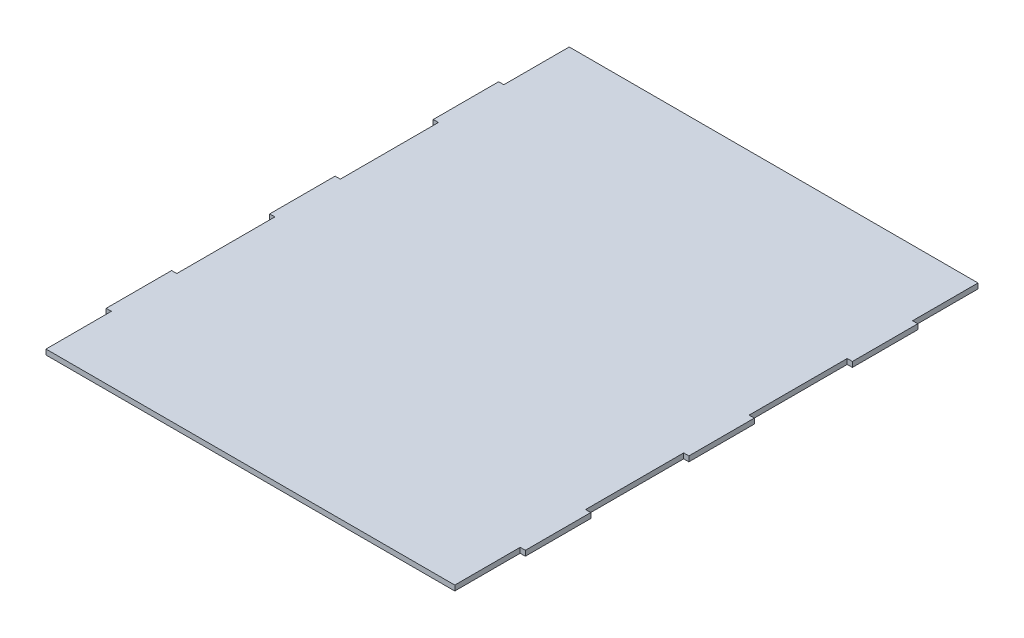
ISO-10303-21;
HEADER;
FILE_DESCRIPTION(('STEP AP214'),'2;1');
FILE_NAME('part.step','',(''),(''),'','','');
FILE_SCHEMA(('AUTOMOTIVE_DESIGN { 1 0 10303 214 1 1 1 1 }'));
ENDSEC;
DATA;
#1=APPLICATION_CONTEXT('core data for automotive mechanical design processes');
#2=APPLICATION_PROTOCOL_DEFINITION('international standard','automotive_design',2000,#1);
#3=PRODUCT_CONTEXT('',#1,'mechanical');
#4=PRODUCT('Part','Part','',(#3));
#5=PRODUCT_RELATED_PRODUCT_CATEGORY('part','',(#4));
#6=PRODUCT_DEFINITION_FORMATION('','',#4);
#7=PRODUCT_DEFINITION_CONTEXT('part definition',#1,'design');
#8=PRODUCT_DEFINITION('design','',#6,#7);
#9=PRODUCT_DEFINITION_SHAPE('','',#8);
#10=(LENGTH_UNIT() NAMED_UNIT(*) SI_UNIT(.MILLI.,.METRE.));
#11=(NAMED_UNIT(*) PLANE_ANGLE_UNIT() SI_UNIT($,.RADIAN.));
#12=(NAMED_UNIT(*) SI_UNIT($,.STERADIAN.) SOLID_ANGLE_UNIT());
#13=UNCERTAINTY_MEASURE_WITH_UNIT(LENGTH_MEASURE(1.E-05),#10,'distance_accuracy_value','');
#14=(GEOMETRIC_REPRESENTATION_CONTEXT(3) GLOBAL_UNCERTAINTY_ASSIGNED_CONTEXT((#13)) GLOBAL_UNIT_ASSIGNED_CONTEXT((#10,
#11,#12)) REPRESENTATION_CONTEXT('',''));
#15=CARTESIAN_POINT('',(0.,0.,0.));
#16=DIRECTION('',(0.,0.,1.));
#17=DIRECTION('',(1.,0.,0.));
#18=AXIS2_PLACEMENT_3D('',#15,#16,#17);
#19=CARTESIAN_POINT('',(250.,3.175,0.));
#20=DIRECTION('',(-1.,0.,0.));
#21=DIRECTION('',(0.,0.,1.));
#22=AXIS2_PLACEMENT_3D('',#19,#20,#21);
#23=PLANE('',#22);
#24=DIRECTION('',(0.,0.,-1.));
#25=VECTOR('',#24,1.);
#26=CARTESIAN_POINT('',(250.,3.175,0.));
#27=LINE('',#26,#25);
#28=CARTESIAN_POINT('',(250.,3.175,240.));
#29=VERTEX_POINT('',#28);
#30=CARTESIAN_POINT('',(250.,3.175,180.));
#31=VERTEX_POINT('',#30);
#32=EDGE_CURVE('E37',#29,#31,#27,.T.);
#33=ORIENTED_EDGE('',*,*,#32,.F.);
#34=DIRECTION('',(0.,1.,0.));
#35=VECTOR('',#34,1.);
#36=CARTESIAN_POINT('',(250.,-40.1258099606725,240.));
#37=LINE('',#36,#35);
#38=CARTESIAN_POINT('',(250.,0.,240.));
#39=VERTEX_POINT('',#38);
#40=EDGE_CURVE('E246',#39,#29,#37,.T.);
#41=ORIENTED_EDGE('',*,*,#40,.F.);
#42=DIRECTION('',(0.,0.,-1.));
#43=VECTOR('',#42,1.);
#44=CARTESIAN_POINT('',(250.,0.,0.));
#45=LINE('',#44,#43);
#46=CARTESIAN_POINT('',(250.,0.,180.));
#47=VERTEX_POINT('',#46);
#48=EDGE_CURVE('E427',#39,#47,#45,.T.);
#49=ORIENTED_EDGE('',*,*,#48,.T.);
#50=DIRECTION('',(0.,1.,0.));
#51=VECTOR('',#50,1.);
#52=CARTESIAN_POINT('',(250.,-40.1258099606725,180.));
#53=LINE('',#52,#51);
#54=EDGE_CURVE('E301',#47,#31,#53,.T.);
#55=ORIENTED_EDGE('',*,*,#54,.T.);
#56=EDGE_LOOP('',(#33,#41,#49,#55));
#57=FACE_BOUND('',#56,.T.);
#58=ADVANCED_FACE('F33',(#57),#23,.F.);
#59=CARTESIAN_POINT('',(0.,3.175,0.));
#60=DIRECTION('',(1.,0.,0.));
#61=DIRECTION('',(0.,0.,-1.));
#62=AXIS2_PLACEMENT_3D('',#59,#60,#61);
#63=PLANE('',#62);
#64=DIRECTION('',(0.,0.,1.));
#65=VECTOR('',#64,1.);
#66=CARTESIAN_POINT('',(0.,3.175,0.));
#67=LINE('',#66,#65);
#68=CARTESIAN_POINT('',(0.,3.175,280.));
#69=VERTEX_POINT('',#68);
#70=CARTESIAN_POINT('',(0.,3.175,320.));
#71=VERTEX_POINT('',#70);
#72=EDGE_CURVE('E421',#69,#71,#67,.T.);
#73=ORIENTED_EDGE('',*,*,#72,.F.);
#74=DIRECTION('',(0.,1.,0.));
#75=VECTOR('',#74,1.);
#76=CARTESIAN_POINT('',(0.,-40.1258099606725,280.));
#77=LINE('',#76,#75);
#78=CARTESIAN_POINT('',(0.,0.,280.));
#79=VERTEX_POINT('',#78);
#80=EDGE_CURVE('E256',#79,#69,#77,.T.);
#81=ORIENTED_EDGE('',*,*,#80,.F.);
#82=DIRECTION('',(0.,0.,1.));
#83=VECTOR('',#82,1.);
#84=CARTESIAN_POINT('',(0.,0.,0.));
#85=LINE('',#84,#83);
#86=CARTESIAN_POINT('',(0.,0.,320.));
#87=VERTEX_POINT('',#86);
#88=EDGE_CURVE('E399',#79,#87,#85,.T.);
#89=ORIENTED_EDGE('',*,*,#88,.T.);
#90=DIRECTION('',(0.,-1.,0.));
#91=VECTOR('',#90,1.);
#92=CARTESIAN_POINT('',(0.,3.175,320.));
#93=LINE('',#92,#91);
#94=EDGE_CURVE('E11',#71,#87,#93,.T.);
#95=ORIENTED_EDGE('',*,*,#94,.F.);
#96=EDGE_LOOP('',(#73,#81,#89,#95));
#97=FACE_BOUND('',#96,.T.);
#98=ADVANCED_FACE('F514',(#97),#63,.F.);
#99=CARTESIAN_POINT('',(250.,3.175,140.));
#100=VERTEX_POINT('',#99);
#101=CARTESIAN_POINT('',(250.,3.175,80.));
#102=VERTEX_POINT('',#101);
#103=EDGE_CURVE('E429',#100,#102,#27,.T.);
#104=ORIENTED_EDGE('',*,*,#103,.F.);
#105=DIRECTION('',(0.,1.,0.));
#106=VECTOR('',#105,1.);
#107=CARTESIAN_POINT('',(250.,-40.1258099606725,140.));
#108=LINE('',#107,#106);
#109=CARTESIAN_POINT('',(250.,0.,140.));
#110=VERTEX_POINT('',#109);
#111=EDGE_CURVE('E297',#110,#100,#108,.T.);
#112=ORIENTED_EDGE('',*,*,#111,.F.);
#113=CARTESIAN_POINT('',(250.,0.,80.));
#114=VERTEX_POINT('',#113);
#115=EDGE_CURVE('E424',#110,#114,#45,.T.);
#116=ORIENTED_EDGE('',*,*,#115,.T.);
#117=DIRECTION('',(0.,1.,0.));
#118=VECTOR('',#117,1.);
#119=CARTESIAN_POINT('',(250.,-40.1258099606725,80.));
#120=LINE('',#119,#118);
#121=EDGE_CURVE('E350',#114,#102,#120,.T.);
#122=ORIENTED_EDGE('',*,*,#121,.T.);
#123=EDGE_LOOP('',(#104,#112,#116,#122));
#124=FACE_BOUND('',#123,.T.);
#125=ADVANCED_FACE('F533',(#124),#23,.F.);
#126=CARTESIAN_POINT('',(0.,0.,180.));
#127=VERTEX_POINT('',#126);
#128=CARTESIAN_POINT('',(0.,0.,240.));
#129=VERTEX_POINT('',#128);
#130=EDGE_CURVE('E422',#127,#129,#85,.T.);
#131=ORIENTED_EDGE('',*,*,#130,.T.);
#132=DIRECTION('',(0.,1.,0.));
#133=VECTOR('',#132,1.);
#134=CARTESIAN_POINT('',(0.,-40.1258099606725,240.));
#135=LINE('',#134,#133);
#136=CARTESIAN_POINT('',(0.,3.175,240.));
#137=VERTEX_POINT('',#136);
#138=EDGE_CURVE('E269',#129,#137,#135,.T.);
#139=ORIENTED_EDGE('',*,*,#138,.T.);
#140=CARTESIAN_POINT('',(0.,3.175,180.));
#141=VERTEX_POINT('',#140);
#142=EDGE_CURVE('E417',#141,#137,#67,.T.);
#143=ORIENTED_EDGE('',*,*,#142,.F.);
#144=DIRECTION('',(0.,1.,0.));
#145=VECTOR('',#144,1.);
#146=CARTESIAN_POINT('',(0.,-40.1258099606725,180.));
#147=LINE('',#146,#145);
#148=EDGE_CURVE('E308',#127,#141,#147,.T.);
#149=ORIENTED_EDGE('',*,*,#148,.F.);
#150=EDGE_LOOP('',(#131,#139,#143,#149));
#151=FACE_BOUND('',#150,.T.);
#152=ADVANCED_FACE('F496',(#151),#63,.F.);
#153=DIRECTION('',(0.,1.,0.));
#154=VECTOR('',#153,1.);
#155=CARTESIAN_POINT('',(250.,-40.1258099606725,40.));
#156=LINE('',#155,#154);
#157=CARTESIAN_POINT('',(250.,0.,40.));
#158=VERTEX_POINT('',#157);
#159=CARTESIAN_POINT('',(250.,3.175,40.));
#160=VERTEX_POINT('',#159);
#161=EDGE_CURVE('E333',#158,#160,#156,.T.);
#162=ORIENTED_EDGE('',*,*,#161,.F.);
#163=CARTESIAN_POINT('',(250.,0.,0.));
#164=VERTEX_POINT('',#163);
#165=EDGE_CURVE('E428',#158,#164,#45,.T.);
#166=ORIENTED_EDGE('',*,*,#165,.T.);
#167=DIRECTION('',(0.,-1.,0.));
#168=VECTOR('',#167,1.);
#169=CARTESIAN_POINT('',(250.,3.175,0.));
#170=LINE('',#169,#168);
#171=CARTESIAN_POINT('',(250.,3.175,0.));
#172=VERTEX_POINT('',#171);
#173=EDGE_CURVE('E457',#172,#164,#170,.T.);
#174=ORIENTED_EDGE('',*,*,#173,.F.);
#175=EDGE_CURVE('E346',#160,#172,#27,.T.);
#176=ORIENTED_EDGE('',*,*,#175,.F.);
#177=EDGE_LOOP('',(#162,#166,#174,#176));
#178=FACE_BOUND('',#177,.T.);
#179=ADVANCED_FACE('F523',(#178),#23,.F.);
#180=CARTESIAN_POINT('',(0.,0.,80.));
#181=VERTEX_POINT('',#180);
#182=CARTESIAN_POINT('',(0.,0.,140.));
#183=VERTEX_POINT('',#182);
#184=EDGE_CURVE('E451',#181,#183,#85,.T.);
#185=ORIENTED_EDGE('',*,*,#184,.T.);
#186=DIRECTION('',(0.,1.,0.));
#187=VECTOR('',#186,1.);
#188=CARTESIAN_POINT('',(0.,-40.1258099606725,140.));
#189=LINE('',#188,#187);
#190=CARTESIAN_POINT('',(0.,3.175,140.));
#191=VERTEX_POINT('',#190);
#192=EDGE_CURVE('E319',#183,#191,#189,.T.);
#193=ORIENTED_EDGE('',*,*,#192,.T.);
#194=CARTESIAN_POINT('',(0.,3.175,80.));
#195=VERTEX_POINT('',#194);
#196=EDGE_CURVE('E385',#195,#191,#67,.T.);
#197=ORIENTED_EDGE('',*,*,#196,.F.);
#198=DIRECTION('',(0.,1.,0.));
#199=VECTOR('',#198,1.);
#200=CARTESIAN_POINT('',(0.,-40.1258099606725,80.));
#201=LINE('',#200,#199);
#202=EDGE_CURVE('E372',#181,#195,#201,.T.);
#203=ORIENTED_EDGE('',*,*,#202,.F.);
#204=EDGE_LOOP('',(#185,#193,#197,#203));
#205=FACE_BOUND('',#204,.T.);
#206=ADVANCED_FACE('F535',(#205),#63,.F.);
#207=CARTESIAN_POINT('',(0.,0.,0.));
#208=VERTEX_POINT('',#207);
#209=CARTESIAN_POINT('',(0.,0.,40.));
#210=VERTEX_POINT('',#209);
#211=EDGE_CURVE('E454',#208,#210,#85,.T.);
#212=ORIENTED_EDGE('',*,*,#211,.T.);
#213=DIRECTION('',(0.,1.,0.));
#214=VECTOR('',#213,1.);
#215=CARTESIAN_POINT('',(0.,-40.1258099606725,40.));
#216=LINE('',#215,#214);
#217=CARTESIAN_POINT('',(0.,3.175,40.));
#218=VERTEX_POINT('',#217);
#219=EDGE_CURVE('E390',#210,#218,#216,.T.);
#220=ORIENTED_EDGE('',*,*,#219,.T.);
#221=CARTESIAN_POINT('',(0.,3.175,0.));
#222=VERTEX_POINT('',#221);
#223=EDGE_CURVE('E414',#222,#218,#67,.T.);
#224=ORIENTED_EDGE('',*,*,#223,.F.);
#225=DIRECTION('',(0.,-1.,0.));
#226=VECTOR('',#225,1.);
#227=CARTESIAN_POINT('',(0.,3.175,0.));
#228=LINE('',#227,#226);
#229=EDGE_CURVE('E459',#222,#208,#228,.T.);
#230=ORIENTED_EDGE('',*,*,#229,.T.);
#231=EDGE_LOOP('',(#212,#220,#224,#230));
#232=FACE_BOUND('',#231,.T.);
#233=ADVANCED_FACE('F35',(#232),#63,.F.);
#234=CARTESIAN_POINT('',(0.,3.175,320.));
#235=DIRECTION('',(0.,0.,-1.));
#236=DIRECTION('',(-1.,0.,0.));
#237=AXIS2_PLACEMENT_3D('',#234,#235,#236);
#238=PLANE('',#237);
#239=DIRECTION('',(1.,0.,0.));
#240=VECTOR('',#239,1.);
#241=CARTESIAN_POINT('',(0.,0.,320.));
#242=LINE('',#241,#240);
#243=CARTESIAN_POINT('',(250.,0.,320.));
#244=VERTEX_POINT('',#243);
#245=EDGE_CURVE('E434',#87,#244,#242,.T.);
#246=ORIENTED_EDGE('',*,*,#245,.T.);
#247=DIRECTION('',(0.,-1.,0.));
#248=VECTOR('',#247,1.);
#249=CARTESIAN_POINT('',(250.,3.175,320.));
#250=LINE('',#249,#248);
#251=CARTESIAN_POINT('',(250.,3.175,320.));
#252=VERTEX_POINT('',#251);
#253=EDGE_CURVE('E43',#252,#244,#250,.T.);
#254=ORIENTED_EDGE('',*,*,#253,.F.);
#255=DIRECTION('',(1.,0.,0.));
#256=VECTOR('',#255,1.);
#257=CARTESIAN_POINT('',(0.,3.175,320.));
#258=LINE('',#257,#256);
#259=EDGE_CURVE('E409',#71,#252,#258,.T.);
#260=ORIENTED_EDGE('',*,*,#259,.F.);
#261=ORIENTED_EDGE('',*,*,#94,.T.);
#262=EDGE_LOOP('',(#246,#254,#260,#261));
#263=FACE_BOUND('',#262,.T.);
#264=ADVANCED_FACE('F518',(#263),#238,.F.);
#265=CARTESIAN_POINT('',(250.,0.,280.));
#266=VERTEX_POINT('',#265);
#267=EDGE_CURVE('E442',#244,#266,#45,.T.);
#268=ORIENTED_EDGE('',*,*,#267,.T.);
#269=DIRECTION('',(0.,1.,0.));
#270=VECTOR('',#269,1.);
#271=CARTESIAN_POINT('',(250.,-40.1258099606725,280.));
#272=LINE('',#271,#270);
#273=CARTESIAN_POINT('',(250.,3.175,280.));
#274=VERTEX_POINT('',#273);
#275=EDGE_CURVE('E58',#266,#274,#272,.T.);
#276=ORIENTED_EDGE('',*,*,#275,.T.);
#277=EDGE_CURVE('E240',#252,#274,#27,.T.);
#278=ORIENTED_EDGE('',*,*,#277,.F.);
#279=ORIENTED_EDGE('',*,*,#253,.T.);
#280=EDGE_LOOP('',(#268,#276,#278,#279));
#281=FACE_BOUND('',#280,.T.);
#282=ADVANCED_FACE('F519',(#281),#23,.F.);
#283=CARTESIAN_POINT('',(0.,3.175,0.));
#284=DIRECTION('',(0.,0.,1.));
#285=DIRECTION('',(1.,0.,0.));
#286=AXIS2_PLACEMENT_3D('',#283,#284,#285);
#287=PLANE('',#286);
#288=DIRECTION('',(-1.,0.,0.));
#289=VECTOR('',#288,1.);
#290=CARTESIAN_POINT('',(0.,0.,0.));
#291=LINE('',#290,#289);
#292=EDGE_CURVE('E435',#164,#208,#291,.T.);
#293=ORIENTED_EDGE('',*,*,#292,.T.);
#294=ORIENTED_EDGE('',*,*,#229,.F.);
#295=DIRECTION('',(-1.,0.,0.));
#296=VECTOR('',#295,1.);
#297=CARTESIAN_POINT('',(0.,3.175,0.));
#298=LINE('',#297,#296);
#299=EDGE_CURVE('E448',#172,#222,#298,.T.);
#300=ORIENTED_EDGE('',*,*,#299,.F.);
#301=ORIENTED_EDGE('',*,*,#173,.T.);
#302=EDGE_LOOP('',(#293,#294,#300,#301));
#303=FACE_BOUND('',#302,.T.);
#304=ADVANCED_FACE('F521',(#303),#287,.F.);
#305=CARTESIAN_POINT('',(0.,3.175,0.));
#306=DIRECTION('',(0.,1.,0.));
#307=DIRECTION('',(0.,0.,1.));
#308=AXIS2_PLACEMENT_3D('',#305,#306,#307);
#309=PLANE('',#308);
#310=ORIENTED_EDGE('',*,*,#223,.T.);
#311=DIRECTION('',(-1.,0.,0.));
#312=VECTOR('',#311,1.);
#313=CARTESIAN_POINT('',(0.,3.175,40.));
#314=LINE('',#313,#312);
#315=CARTESIAN_POINT('',(-3.175,3.175,40.));
#316=VERTEX_POINT('',#315);
#317=EDGE_CURVE('E359',#218,#316,#314,.T.);
#318=ORIENTED_EDGE('',*,*,#317,.T.);
#319=DIRECTION('',(0.,0.,1.));
#320=VECTOR('',#319,1.);
#321=CARTESIAN_POINT('',(-3.175,3.175,40.));
#322=LINE('',#321,#320);
#323=CARTESIAN_POINT('',(-3.17499999999999,3.175,80.));
#324=VERTEX_POINT('',#323);
#325=EDGE_CURVE('E373',#316,#324,#322,.T.);
#326=ORIENTED_EDGE('',*,*,#325,.T.);
#327=DIRECTION('',(1.,0.,0.));
#328=VECTOR('',#327,1.);
#329=CARTESIAN_POINT('',(0.,3.175,80.));
#330=LINE('',#329,#328);
#331=EDGE_CURVE('E376',#324,#195,#330,.T.);
#332=ORIENTED_EDGE('',*,*,#331,.T.);
#333=ORIENTED_EDGE('',*,*,#196,.T.);
#334=DIRECTION('',(-1.,0.,0.));
#335=VECTOR('',#334,1.);
#336=CARTESIAN_POINT('',(0.,3.175,140.));
#337=LINE('',#336,#335);
#338=CARTESIAN_POINT('',(-3.17499999999999,3.175,140.));
#339=VERTEX_POINT('',#338);
#340=EDGE_CURVE('E288',#191,#339,#337,.T.);
#341=ORIENTED_EDGE('',*,*,#340,.T.);
#342=DIRECTION('',(0.,0.,1.));
#343=VECTOR('',#342,1.);
#344=CARTESIAN_POINT('',(-3.17499999999999,3.175,140.));
#345=LINE('',#344,#343);
#346=CARTESIAN_POINT('',(-3.17499999999998,3.175,180.));
#347=VERTEX_POINT('',#346);
#348=EDGE_CURVE('E313',#339,#347,#345,.T.);
#349=ORIENTED_EDGE('',*,*,#348,.T.);
#350=DIRECTION('',(1.,0.,0.));
#351=VECTOR('',#350,1.);
#352=CARTESIAN_POINT('',(0.,3.175,180.));
#353=LINE('',#352,#351);
#354=EDGE_CURVE('E316',#347,#141,#353,.T.);
#355=ORIENTED_EDGE('',*,*,#354,.T.);
#356=ORIENTED_EDGE('',*,*,#142,.T.);
#357=DIRECTION('',(-1.,0.,0.));
#358=VECTOR('',#357,1.);
#359=CARTESIAN_POINT('',(0.,3.175,240.));
#360=LINE('',#359,#358);
#361=CARTESIAN_POINT('',(-3.17499999999998,3.175,240.));
#362=VERTEX_POINT('',#361);
#363=EDGE_CURVE('E259',#137,#362,#360,.T.);
#364=ORIENTED_EDGE('',*,*,#363,.T.);
#365=DIRECTION('',(0.,0.,1.));
#366=VECTOR('',#365,1.);
#367=CARTESIAN_POINT('',(-3.17499999999998,3.175,240.));
#368=LINE('',#367,#366);
#369=CARTESIAN_POINT('',(-3.17499999999997,3.175,280.));
#370=VERTEX_POINT('',#369);
#371=EDGE_CURVE('E262',#362,#370,#368,.T.);
#372=ORIENTED_EDGE('',*,*,#371,.T.);
#373=DIRECTION('',(1.,0.,0.));
#374=VECTOR('',#373,1.);
#375=CARTESIAN_POINT('',(0.,3.175,280.));
#376=LINE('',#375,#374);
#377=EDGE_CURVE('E266',#370,#69,#376,.T.);
#378=ORIENTED_EDGE('',*,*,#377,.T.);
#379=ORIENTED_EDGE('',*,*,#72,.T.);
#380=ORIENTED_EDGE('',*,*,#259,.T.);
#381=ORIENTED_EDGE('',*,*,#277,.T.);
#382=DIRECTION('',(1.,0.,0.));
#383=VECTOR('',#382,1.);
#384=CARTESIAN_POINT('',(250.,3.175,280.));
#385=LINE('',#384,#383);
#386=CARTESIAN_POINT('',(253.175,3.175,280.));
#387=VERTEX_POINT('',#386);
#388=EDGE_CURVE('E226',#274,#387,#385,.T.);
#389=ORIENTED_EDGE('',*,*,#388,.T.);
#390=DIRECTION('',(0.,0.,-1.));
#391=VECTOR('',#390,1.);
#392=CARTESIAN_POINT('',(253.175,3.175,240.));
#393=LINE('',#392,#391);
#394=CARTESIAN_POINT('',(253.175,3.175,240.));
#395=VERTEX_POINT('',#394);
#396=EDGE_CURVE('E239',#387,#395,#393,.T.);
#397=ORIENTED_EDGE('',*,*,#396,.T.);
#398=DIRECTION('',(-1.,0.,0.));
#399=VECTOR('',#398,1.);
#400=CARTESIAN_POINT('',(250.,3.175,240.));
#401=LINE('',#400,#399);
#402=EDGE_CURVE('E241',#395,#29,#401,.T.);
#403=ORIENTED_EDGE('',*,*,#402,.T.);
#404=ORIENTED_EDGE('',*,*,#32,.T.);
#405=DIRECTION('',(1.,0.,0.));
#406=VECTOR('',#405,1.);
#407=CARTESIAN_POINT('',(250.,3.175,180.));
#408=LINE('',#407,#406);
#409=CARTESIAN_POINT('',(253.175,3.175,180.));
#410=VERTEX_POINT('',#409);
#411=EDGE_CURVE('E291',#31,#410,#408,.T.);
#412=ORIENTED_EDGE('',*,*,#411,.T.);
#413=DIRECTION('',(0.,0.,-1.));
#414=VECTOR('',#413,1.);
#415=CARTESIAN_POINT('',(253.175,3.175,140.));
#416=LINE('',#415,#414);
#417=CARTESIAN_POINT('',(253.175,3.175,140.));
#418=VERTEX_POINT('',#417);
#419=EDGE_CURVE('E294',#410,#418,#416,.T.);
#420=ORIENTED_EDGE('',*,*,#419,.T.);
#421=DIRECTION('',(-1.,0.,0.));
#422=VECTOR('',#421,1.);
#423=CARTESIAN_POINT('',(250.,3.175,140.));
#424=LINE('',#423,#422);
#425=EDGE_CURVE('E279',#418,#100,#424,.T.);
#426=ORIENTED_EDGE('',*,*,#425,.T.);
#427=ORIENTED_EDGE('',*,*,#103,.T.);
#428=DIRECTION('',(1.,0.,0.));
#429=VECTOR('',#428,1.);
#430=CARTESIAN_POINT('',(250.,3.175,80.));
#431=LINE('',#430,#429);
#432=CARTESIAN_POINT('',(253.175,3.175,80.));
#433=VERTEX_POINT('',#432);
#434=EDGE_CURVE('E329',#102,#433,#431,.T.);
#435=ORIENTED_EDGE('',*,*,#434,.T.);
#436=DIRECTION('',(0.,0.,-1.));
#437=VECTOR('',#436,1.);
#438=CARTESIAN_POINT('',(253.175,3.175,40.));
#439=LINE('',#438,#437);
#440=CARTESIAN_POINT('',(253.175,3.175,40.));
#441=VERTEX_POINT('',#440);
#442=EDGE_CURVE('E334',#433,#441,#439,.T.);
#443=ORIENTED_EDGE('',*,*,#442,.T.);
#444=DIRECTION('',(-1.,0.,0.));
#445=VECTOR('',#444,1.);
#446=CARTESIAN_POINT('',(250.,3.175,40.));
#447=LINE('',#446,#445);
#448=EDGE_CURVE('E337',#441,#160,#447,.T.);
#449=ORIENTED_EDGE('',*,*,#448,.T.);
#450=ORIENTED_EDGE('',*,*,#175,.T.);
#451=ORIENTED_EDGE('',*,*,#299,.T.);
#452=EDGE_LOOP('',(#310,#318,#326,#332,#333,#341,#349,#355,#356,#364,#372,#378,#379,#380,#381,
#389,#397,#403,#404,#412,#420,#426,#427,#435,#443,#449,#450,#451));
#453=FACE_BOUND('',#452,.T.);
#454=ADVANCED_FACE('F237',(#453),#309,.T.);
#455=CARTESIAN_POINT('',(0.,0.,0.));
#456=DIRECTION('',(0.,1.,0.));
#457=DIRECTION('',(0.,0.,1.));
#458=AXIS2_PLACEMENT_3D('',#455,#456,#457);
#459=PLANE('',#458);
#460=ORIENTED_EDGE('',*,*,#211,.F.);
#461=ORIENTED_EDGE('',*,*,#292,.F.);
#462=ORIENTED_EDGE('',*,*,#165,.F.);
#463=DIRECTION('',(1.,0.,0.));
#464=VECTOR('',#463,1.);
#465=CARTESIAN_POINT('',(250.,0.,40.));
#466=LINE('',#465,#464);
#467=CARTESIAN_POINT('',(253.175,0.,40.));
#468=VERTEX_POINT('',#467);
#469=EDGE_CURVE('E332',#158,#468,#466,.T.);
#470=ORIENTED_EDGE('',*,*,#469,.T.);
#471=DIRECTION('',(0.,0.,1.));
#472=VECTOR('',#471,1.);
#473=CARTESIAN_POINT('',(253.175,0.,40.));
#474=LINE('',#473,#472);
#475=CARTESIAN_POINT('',(253.175,0.,80.));
#476=VERTEX_POINT('',#475);
#477=EDGE_CURVE('E330',#468,#476,#474,.T.);
#478=ORIENTED_EDGE('',*,*,#477,.T.);
#479=DIRECTION('',(-1.,0.,0.));
#480=VECTOR('',#479,1.);
#481=CARTESIAN_POINT('',(250.,0.,80.));
#482=LINE('',#481,#480);
#483=EDGE_CURVE('E354',#476,#114,#482,.T.);
#484=ORIENTED_EDGE('',*,*,#483,.T.);
#485=ORIENTED_EDGE('',*,*,#115,.F.);
#486=DIRECTION('',(1.,0.,0.));
#487=VECTOR('',#486,1.);
#488=CARTESIAN_POINT('',(250.,0.,140.));
#489=LINE('',#488,#487);
#490=CARTESIAN_POINT('',(253.175,0.,140.));
#491=VERTEX_POINT('',#490);
#492=EDGE_CURVE('E286',#110,#491,#489,.T.);
#493=ORIENTED_EDGE('',*,*,#492,.T.);
#494=DIRECTION('',(0.,0.,1.));
#495=VECTOR('',#494,1.);
#496=CARTESIAN_POINT('',(253.175,0.,140.));
#497=LINE('',#496,#495);
#498=CARTESIAN_POINT('',(253.175,0.,180.));
#499=VERTEX_POINT('',#498);
#500=EDGE_CURVE('E283',#491,#499,#497,.T.);
#501=ORIENTED_EDGE('',*,*,#500,.T.);
#502=DIRECTION('',(-1.,0.,0.));
#503=VECTOR('',#502,1.);
#504=CARTESIAN_POINT('',(250.,0.,180.));
#505=LINE('',#504,#503);
#506=EDGE_CURVE('E280',#499,#47,#505,.T.);
#507=ORIENTED_EDGE('',*,*,#506,.T.);
#508=ORIENTED_EDGE('',*,*,#48,.F.);
#509=DIRECTION('',(1.,0.,0.));
#510=VECTOR('',#509,1.);
#511=CARTESIAN_POINT('',(250.,0.,240.));
#512=LINE('',#511,#510);
#513=CARTESIAN_POINT('',(253.175,0.,240.));
#514=VERTEX_POINT('',#513);
#515=EDGE_CURVE('E263',#39,#514,#512,.T.);
#516=ORIENTED_EDGE('',*,*,#515,.T.);
#517=DIRECTION('',(0.,0.,1.));
#518=VECTOR('',#517,1.);
#519=CARTESIAN_POINT('',(253.175,0.,240.));
#520=LINE('',#519,#518);
#521=CARTESIAN_POINT('',(253.175,0.,280.));
#522=VERTEX_POINT('',#521);
#523=EDGE_CURVE('E715',#514,#522,#520,.T.);
#524=ORIENTED_EDGE('',*,*,#523,.T.);
#525=DIRECTION('',(-1.,0.,0.));
#526=VECTOR('',#525,1.);
#527=CARTESIAN_POINT('',(250.,0.,280.));
#528=LINE('',#527,#526);
#529=EDGE_CURVE('E228',#522,#266,#528,.T.);
#530=ORIENTED_EDGE('',*,*,#529,.T.);
#531=ORIENTED_EDGE('',*,*,#267,.F.);
#532=ORIENTED_EDGE('',*,*,#245,.F.);
#533=ORIENTED_EDGE('',*,*,#88,.F.);
#534=DIRECTION('',(-1.,0.,0.));
#535=VECTOR('',#534,1.);
#536=CARTESIAN_POINT('',(0.,0.,280.));
#537=LINE('',#536,#535);
#538=CARTESIAN_POINT('',(-3.17499999999997,0.,280.));
#539=VERTEX_POINT('',#538);
#540=EDGE_CURVE('E255',#79,#539,#537,.T.);
#541=ORIENTED_EDGE('',*,*,#540,.T.);
#542=DIRECTION('',(0.,0.,-1.));
#543=VECTOR('',#542,1.);
#544=CARTESIAN_POINT('',(-3.17499999999998,0.,240.));
#545=LINE('',#544,#543);
#546=CARTESIAN_POINT('',(-3.17499999999998,0.,240.));
#547=VERTEX_POINT('',#546);
#548=EDGE_CURVE('E253',#539,#547,#545,.T.);
#549=ORIENTED_EDGE('',*,*,#548,.T.);
#550=DIRECTION('',(1.,0.,0.));
#551=VECTOR('',#550,1.);
#552=CARTESIAN_POINT('',(0.,0.,240.));
#553=LINE('',#552,#551);
#554=EDGE_CURVE('E258',#547,#129,#553,.T.);
#555=ORIENTED_EDGE('',*,*,#554,.T.);
#556=ORIENTED_EDGE('',*,*,#130,.F.);
#557=DIRECTION('',(-1.,0.,0.));
#558=VECTOR('',#557,1.);
#559=CARTESIAN_POINT('',(0.,0.,180.));
#560=LINE('',#559,#558);
#561=CARTESIAN_POINT('',(-3.17499999999998,0.,180.));
#562=VERTEX_POINT('',#561);
#563=EDGE_CURVE('E307',#127,#562,#560,.T.);
#564=ORIENTED_EDGE('',*,*,#563,.T.);
#565=DIRECTION('',(0.,0.,-1.));
#566=VECTOR('',#565,1.);
#567=CARTESIAN_POINT('',(-3.17499999999999,0.,140.));
#568=LINE('',#567,#566);
#569=CARTESIAN_POINT('',(-3.17499999999999,0.,140.));
#570=VERTEX_POINT('',#569);
#571=EDGE_CURVE('E305',#562,#570,#568,.T.);
#572=ORIENTED_EDGE('',*,*,#571,.T.);
#573=DIRECTION('',(1.,0.,0.));
#574=VECTOR('',#573,1.);
#575=CARTESIAN_POINT('',(0.,0.,140.));
#576=LINE('',#575,#574);
#577=EDGE_CURVE('E310',#570,#183,#576,.T.);
#578=ORIENTED_EDGE('',*,*,#577,.T.);
#579=ORIENTED_EDGE('',*,*,#184,.F.);
#580=DIRECTION('',(-1.,0.,0.));
#581=VECTOR('',#580,1.);
#582=CARTESIAN_POINT('',(0.,0.,80.));
#583=LINE('',#582,#581);
#584=CARTESIAN_POINT('',(-3.17499999999999,0.,80.));
#585=VERTEX_POINT('',#584);
#586=EDGE_CURVE('E371',#181,#585,#583,.T.);
#587=ORIENTED_EDGE('',*,*,#586,.T.);
#588=DIRECTION('',(0.,0.,-1.));
#589=VECTOR('',#588,1.);
#590=CARTESIAN_POINT('',(-3.175,0.,40.));
#591=LINE('',#590,#589);
#592=CARTESIAN_POINT('',(-3.175,0.,40.));
#593=VERTEX_POINT('',#592);
#594=EDGE_CURVE('E369',#585,#593,#591,.T.);
#595=ORIENTED_EDGE('',*,*,#594,.T.);
#596=DIRECTION('',(1.,0.,0.));
#597=VECTOR('',#596,1.);
#598=CARTESIAN_POINT('',(0.,0.,40.));
#599=LINE('',#598,#597);
#600=EDGE_CURVE('E394',#593,#210,#599,.T.);
#601=ORIENTED_EDGE('',*,*,#600,.T.);
#602=EDGE_LOOP('',(#460,#461,#462,#470,#478,#484,#485,#493,#501,#507,#508,#516,#524,#530,#531,
#532,#533,#541,#549,#555,#556,#564,#572,#578,#579,#587,#595,#601));
#603=FACE_BOUND('',#602,.T.);
#604=ADVANCED_FACE('F562',(#603),#459,.F.);
#605=CARTESIAN_POINT('',(0.,-40.1258099606725,80.));
#606=DIRECTION('',(0.,0.,1.));
#607=DIRECTION('',(1.,0.,0.));
#608=AXIS2_PLACEMENT_3D('',#605,#606,#607);
#609=PLANE('',#608);
#610=ORIENTED_EDGE('',*,*,#586,.F.);
#611=ORIENTED_EDGE('',*,*,#202,.T.);
#612=ORIENTED_EDGE('',*,*,#331,.F.);
#613=DIRECTION('',(0.,1.,0.));
#614=VECTOR('',#613,1.);
#615=CARTESIAN_POINT('',(-3.17499999999999,-40.1258099606725,80.));
#616=LINE('',#615,#614);
#617=EDGE_CURVE('E379',#585,#324,#616,.T.);
#618=ORIENTED_EDGE('',*,*,#617,.F.);
#619=EDGE_LOOP('',(#610,#611,#612,#618));
#620=FACE_BOUND('',#619,.T.);
#621=ADVANCED_FACE('F597',(#620),#609,.T.);
#622=CARTESIAN_POINT('',(-3.175,-40.1258099606725,40.));
#623=DIRECTION('',(-1.,0.,0.));
#624=DIRECTION('',(0.,0.,1.));
#625=AXIS2_PLACEMENT_3D('',#622,#623,#624);
#626=PLANE('',#625);
#627=ORIENTED_EDGE('',*,*,#594,.F.);
#628=ORIENTED_EDGE('',*,*,#617,.T.);
#629=ORIENTED_EDGE('',*,*,#325,.F.);
#630=DIRECTION('',(0.,1.,0.));
#631=VECTOR('',#630,1.);
#632=CARTESIAN_POINT('',(-3.175,-40.1258099606725,40.));
#633=LINE('',#632,#631);
#634=EDGE_CURVE('E404',#593,#316,#633,.T.);
#635=ORIENTED_EDGE('',*,*,#634,.F.);
#636=EDGE_LOOP('',(#627,#628,#629,#635));
#637=FACE_BOUND('',#636,.T.);
#638=ADVANCED_FACE('F600',(#637),#626,.T.);
#639=CARTESIAN_POINT('',(0.,-40.1258099606725,40.));
#640=DIRECTION('',(0.,0.,-1.));
#641=DIRECTION('',(-1.,0.,0.));
#642=AXIS2_PLACEMENT_3D('',#639,#640,#641);
#643=PLANE('',#642);
#644=ORIENTED_EDGE('',*,*,#600,.F.);
#645=ORIENTED_EDGE('',*,*,#634,.T.);
#646=ORIENTED_EDGE('',*,*,#317,.F.);
#647=ORIENTED_EDGE('',*,*,#219,.F.);
#648=EDGE_LOOP('',(#644,#645,#646,#647));
#649=FACE_BOUND('',#648,.T.);
#650=ADVANCED_FACE('F589',(#649),#643,.T.);
#651=CARTESIAN_POINT('',(250.,-40.1258099606725,40.));
#652=DIRECTION('',(0.,0.,-1.));
#653=DIRECTION('',(-1.,0.,0.));
#654=AXIS2_PLACEMENT_3D('',#651,#652,#653);
#655=PLANE('',#654);
#656=ORIENTED_EDGE('',*,*,#469,.F.);
#657=ORIENTED_EDGE('',*,*,#161,.T.);
#658=ORIENTED_EDGE('',*,*,#448,.F.);
#659=DIRECTION('',(0.,1.,0.));
#660=VECTOR('',#659,1.);
#661=CARTESIAN_POINT('',(253.175,-40.1258099606725,40.));
#662=LINE('',#661,#660);
#663=EDGE_CURVE('E340',#468,#441,#662,.T.);
#664=ORIENTED_EDGE('',*,*,#663,.F.);
#665=EDGE_LOOP('',(#656,#657,#658,#664));
#666=FACE_BOUND('',#665,.T.);
#667=ADVANCED_FACE('F585',(#666),#655,.T.);
#668=CARTESIAN_POINT('',(253.175,-40.1258099606725,40.));
#669=DIRECTION('',(1.,0.,0.));
#670=DIRECTION('',(0.,0.,-1.));
#671=AXIS2_PLACEMENT_3D('',#668,#669,#670);
#672=PLANE('',#671);
#673=ORIENTED_EDGE('',*,*,#477,.F.);
#674=ORIENTED_EDGE('',*,*,#663,.T.);
#675=ORIENTED_EDGE('',*,*,#442,.F.);
#676=DIRECTION('',(0.,1.,0.));
#677=VECTOR('',#676,1.);
#678=CARTESIAN_POINT('',(253.175,-40.1258099606725,80.));
#679=LINE('',#678,#677);
#680=EDGE_CURVE('E365',#476,#433,#679,.T.);
#681=ORIENTED_EDGE('',*,*,#680,.F.);
#682=EDGE_LOOP('',(#673,#674,#675,#681));
#683=FACE_BOUND('',#682,.T.);
#684=ADVANCED_FACE('F588',(#683),#672,.T.);
#685=CARTESIAN_POINT('',(250.,-40.1258099606725,80.));
#686=DIRECTION('',(0.,0.,1.));
#687=DIRECTION('',(1.,0.,0.));
#688=AXIS2_PLACEMENT_3D('',#685,#686,#687);
#689=PLANE('',#688);
#690=ORIENTED_EDGE('',*,*,#483,.F.);
#691=ORIENTED_EDGE('',*,*,#680,.T.);
#692=ORIENTED_EDGE('',*,*,#434,.F.);
#693=ORIENTED_EDGE('',*,*,#121,.F.);
#694=EDGE_LOOP('',(#690,#691,#692,#693));
#695=FACE_BOUND('',#694,.T.);
#696=ADVANCED_FACE('F580',(#695),#689,.T.);
#697=CARTESIAN_POINT('',(0.,-40.1258099606725,180.));
#698=DIRECTION('',(0.,0.,1.));
#699=DIRECTION('',(1.,0.,0.));
#700=AXIS2_PLACEMENT_3D('',#697,#698,#699);
#701=PLANE('',#700);
#702=ORIENTED_EDGE('',*,*,#563,.F.);
#703=ORIENTED_EDGE('',*,*,#148,.T.);
#704=ORIENTED_EDGE('',*,*,#354,.F.);
#705=DIRECTION('',(0.,1.,0.));
#706=VECTOR('',#705,1.);
#707=CARTESIAN_POINT('',(-3.17499999999998,-40.1258099606725,180.));
#708=LINE('',#707,#706);
#709=EDGE_CURVE('E322',#562,#347,#708,.T.);
#710=ORIENTED_EDGE('',*,*,#709,.F.);
#711=EDGE_LOOP('',(#702,#703,#704,#710));
#712=FACE_BOUND('',#711,.T.);
#713=ADVANCED_FACE('F493',(#712),#701,.T.);
#714=CARTESIAN_POINT('',(-3.17499999999999,-40.1258099606725,140.));
#715=DIRECTION('',(-1.,0.,0.));
#716=DIRECTION('',(0.,0.,1.));
#717=AXIS2_PLACEMENT_3D('',#714,#715,#716);
#718=PLANE('',#717);
#719=ORIENTED_EDGE('',*,*,#571,.F.);
#720=ORIENTED_EDGE('',*,*,#709,.T.);
#721=ORIENTED_EDGE('',*,*,#348,.F.);
#722=DIRECTION('',(0.,1.,0.));
#723=VECTOR('',#722,1.);
#724=CARTESIAN_POINT('',(-3.17499999999999,-40.1258099606725,140.));
#725=LINE('',#724,#723);
#726=EDGE_CURVE('E324',#570,#339,#725,.T.);
#727=ORIENTED_EDGE('',*,*,#726,.F.);
#728=EDGE_LOOP('',(#719,#720,#721,#727));
#729=FACE_BOUND('',#728,.T.);
#730=ADVANCED_FACE('F488',(#729),#718,.T.);
#731=CARTESIAN_POINT('',(0.,-40.1258099606725,140.));
#732=DIRECTION('',(0.,0.,-1.));
#733=DIRECTION('',(-1.,0.,0.));
#734=AXIS2_PLACEMENT_3D('',#731,#732,#733);
#735=PLANE('',#734);
#736=ORIENTED_EDGE('',*,*,#577,.F.);
#737=ORIENTED_EDGE('',*,*,#726,.T.);
#738=ORIENTED_EDGE('',*,*,#340,.F.);
#739=ORIENTED_EDGE('',*,*,#192,.F.);
#740=EDGE_LOOP('',(#736,#737,#738,#739));
#741=FACE_BOUND('',#740,.T.);
#742=ADVANCED_FACE('F483',(#741),#735,.T.);
#743=CARTESIAN_POINT('',(250.,-40.1258099606725,140.));
#744=DIRECTION('',(0.,0.,-1.));
#745=DIRECTION('',(-1.,0.,0.));
#746=AXIS2_PLACEMENT_3D('',#743,#744,#745);
#747=PLANE('',#746);
#748=ORIENTED_EDGE('',*,*,#492,.F.);
#749=ORIENTED_EDGE('',*,*,#111,.T.);
#750=ORIENTED_EDGE('',*,*,#425,.F.);
#751=DIRECTION('',(0.,1.,0.));
#752=VECTOR('',#751,1.);
#753=CARTESIAN_POINT('',(253.175,-40.1258099606725,140.));
#754=LINE('',#753,#752);
#755=EDGE_CURVE('E284',#491,#418,#754,.T.);
#756=ORIENTED_EDGE('',*,*,#755,.F.);
#757=EDGE_LOOP('',(#748,#749,#750,#756));
#758=FACE_BOUND('',#757,.T.);
#759=ADVANCED_FACE('F552',(#758),#747,.T.);
#760=CARTESIAN_POINT('',(253.175,-40.1258099606725,140.));
#761=DIRECTION('',(1.,0.,0.));
#762=DIRECTION('',(0.,0.,-1.));
#763=AXIS2_PLACEMENT_3D('',#760,#761,#762);
#764=PLANE('',#763);
#765=ORIENTED_EDGE('',*,*,#500,.F.);
#766=ORIENTED_EDGE('',*,*,#755,.T.);
#767=ORIENTED_EDGE('',*,*,#419,.F.);
#768=DIRECTION('',(0.,1.,0.));
#769=VECTOR('',#768,1.);
#770=CARTESIAN_POINT('',(253.175,-40.1258099606725,180.));
#771=LINE('',#770,#769);
#772=EDGE_CURVE('E299',#499,#410,#771,.T.);
#773=ORIENTED_EDGE('',*,*,#772,.F.);
#774=EDGE_LOOP('',(#765,#766,#767,#773));
#775=FACE_BOUND('',#774,.T.);
#776=ADVANCED_FACE('F559',(#775),#764,.T.);
#777=CARTESIAN_POINT('',(250.,-40.1258099606725,180.));
#778=DIRECTION('',(0.,0.,1.));
#779=DIRECTION('',(1.,0.,0.));
#780=AXIS2_PLACEMENT_3D('',#777,#778,#779);
#781=PLANE('',#780);
#782=ORIENTED_EDGE('',*,*,#506,.F.);
#783=ORIENTED_EDGE('',*,*,#772,.T.);
#784=ORIENTED_EDGE('',*,*,#411,.F.);
#785=ORIENTED_EDGE('',*,*,#54,.F.);
#786=EDGE_LOOP('',(#782,#783,#784,#785));
#787=FACE_BOUND('',#786,.T.);
#788=ADVANCED_FACE('F565',(#787),#781,.T.);
#789=CARTESIAN_POINT('',(0.,-40.1258099606725,280.));
#790=DIRECTION('',(0.,0.,1.));
#791=DIRECTION('',(1.,0.,0.));
#792=AXIS2_PLACEMENT_3D('',#789,#790,#791);
#793=PLANE('',#792);
#794=ORIENTED_EDGE('',*,*,#540,.F.);
#795=ORIENTED_EDGE('',*,*,#80,.T.);
#796=ORIENTED_EDGE('',*,*,#377,.F.);
#797=DIRECTION('',(0.,1.,0.));
#798=VECTOR('',#797,1.);
#799=CARTESIAN_POINT('',(-3.17499999999997,-40.1258099606725,280.));
#800=LINE('',#799,#798);
#801=EDGE_CURVE('E272',#539,#370,#800,.T.);
#802=ORIENTED_EDGE('',*,*,#801,.F.);
#803=EDGE_LOOP('',(#794,#795,#796,#802));
#804=FACE_BOUND('',#803,.T.);
#805=ADVANCED_FACE('F511',(#804),#793,.T.);
#806=CARTESIAN_POINT('',(-3.17499999999998,-40.1258099606725,240.));
#807=DIRECTION('',(-1.,0.,0.));
#808=DIRECTION('',(0.,0.,1.));
#809=AXIS2_PLACEMENT_3D('',#806,#807,#808);
#810=PLANE('',#809);
#811=ORIENTED_EDGE('',*,*,#548,.F.);
#812=ORIENTED_EDGE('',*,*,#801,.T.);
#813=ORIENTED_EDGE('',*,*,#371,.F.);
#814=DIRECTION('',(0.,1.,0.));
#815=VECTOR('',#814,1.);
#816=CARTESIAN_POINT('',(-3.17499999999998,-40.1258099606725,240.));
#817=LINE('',#816,#815);
#818=EDGE_CURVE('E274',#547,#362,#817,.T.);
#819=ORIENTED_EDGE('',*,*,#818,.F.);
#820=EDGE_LOOP('',(#811,#812,#813,#819));
#821=FACE_BOUND('',#820,.T.);
#822=ADVANCED_FACE('F506',(#821),#810,.T.);
#823=CARTESIAN_POINT('',(0.,-40.1258099606725,240.));
#824=DIRECTION('',(0.,0.,-1.));
#825=DIRECTION('',(-1.,0.,0.));
#826=AXIS2_PLACEMENT_3D('',#823,#824,#825);
#827=PLANE('',#826);
#828=ORIENTED_EDGE('',*,*,#554,.F.);
#829=ORIENTED_EDGE('',*,*,#818,.T.);
#830=ORIENTED_EDGE('',*,*,#363,.F.);
#831=ORIENTED_EDGE('',*,*,#138,.F.);
#832=EDGE_LOOP('',(#828,#829,#830,#831));
#833=FACE_BOUND('',#832,.T.);
#834=ADVANCED_FACE('F501',(#833),#827,.T.);
#835=CARTESIAN_POINT('',(250.,-40.1258099606725,240.));
#836=DIRECTION('',(0.,0.,-1.));
#837=DIRECTION('',(-1.,0.,0.));
#838=AXIS2_PLACEMENT_3D('',#835,#836,#837);
#839=PLANE('',#838);
#840=ORIENTED_EDGE('',*,*,#515,.F.);
#841=ORIENTED_EDGE('',*,*,#40,.T.);
#842=ORIENTED_EDGE('',*,*,#402,.F.);
#843=DIRECTION('',(0.,1.,0.));
#844=VECTOR('',#843,1.);
#845=CARTESIAN_POINT('',(253.175,-40.1258099606725,240.));
#846=LINE('',#845,#844);
#847=EDGE_CURVE('E232',#514,#395,#846,.T.);
#848=ORIENTED_EDGE('',*,*,#847,.F.);
#849=EDGE_LOOP('',(#840,#841,#842,#848));
#850=FACE_BOUND('',#849,.T.);
#851=ADVANCED_FACE('F686',(#850),#839,.T.);
#852=CARTESIAN_POINT('',(253.175,-40.1258099606725,240.));
#853=DIRECTION('',(1.,0.,0.));
#854=DIRECTION('',(0.,0.,-1.));
#855=AXIS2_PLACEMENT_3D('',#852,#853,#854);
#856=PLANE('',#855);
#857=ORIENTED_EDGE('',*,*,#523,.F.);
#858=ORIENTED_EDGE('',*,*,#847,.T.);
#859=ORIENTED_EDGE('',*,*,#396,.F.);
#860=DIRECTION('',(0.,1.,0.));
#861=VECTOR('',#860,1.);
#862=CARTESIAN_POINT('',(253.175,-40.1258099606725,280.));
#863=LINE('',#862,#861);
#864=EDGE_CURVE('E223',#522,#387,#863,.T.);
#865=ORIENTED_EDGE('',*,*,#864,.F.);
#866=EDGE_LOOP('',(#857,#858,#859,#865));
#867=FACE_BOUND('',#866,.T.);
#868=ADVANCED_FACE('F243',(#867),#856,.T.);
#869=CARTESIAN_POINT('',(250.,-40.1258099606725,280.));
#870=DIRECTION('',(0.,0.,1.));
#871=DIRECTION('',(1.,0.,0.));
#872=AXIS2_PLACEMENT_3D('',#869,#870,#871);
#873=PLANE('',#872);
#874=ORIENTED_EDGE('',*,*,#529,.F.);
#875=ORIENTED_EDGE('',*,*,#864,.T.);
#876=ORIENTED_EDGE('',*,*,#388,.F.);
#877=ORIENTED_EDGE('',*,*,#275,.F.);
#878=EDGE_LOOP('',(#874,#875,#876,#877));
#879=FACE_BOUND('',#878,.T.);
#880=ADVANCED_FACE('F225',(#879),#873,.T.);
#881=CLOSED_SHELL('',(#58,#98,#125,#152,#179,#206,#233,#264,#282,#304,#454,#604,#621,#638,#650,
#667,#684,#696,#713,#730,#742,#759,#776,#788,#805,#822,#834,#851,#868,#880));
#882=MANIFOLD_SOLID_BREP('B2',#881);
#883=ADVANCED_BREP_SHAPE_REPRESENTATION('',(#18,#882),#14);
#884=SHAPE_DEFINITION_REPRESENTATION(#9,#883);
ENDSEC;
END-ISO-10303-21;
